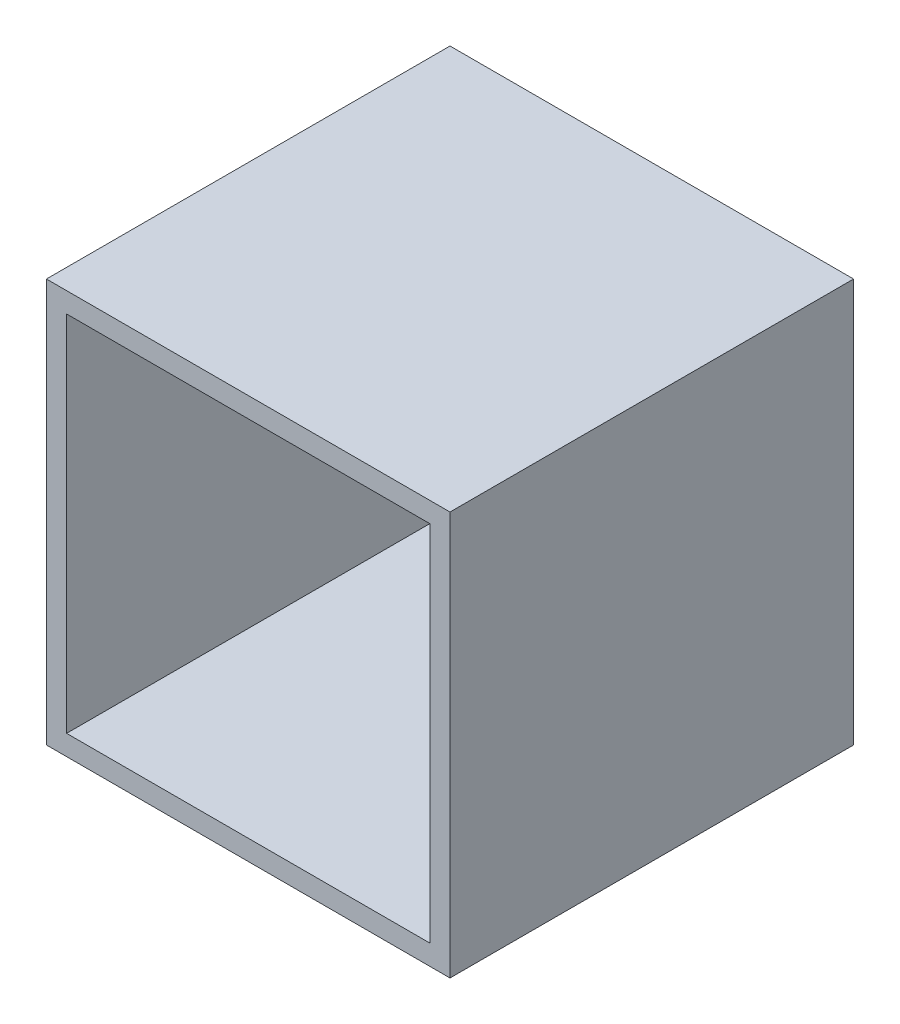
ISO-10303-21;
HEADER;
FILE_DESCRIPTION(('STEP AP214'),'2;1');
FILE_NAME('part.step','',(''),(''),'','','');
FILE_SCHEMA(('AUTOMOTIVE_DESIGN { 1 0 10303 214 1 1 1 1 }'));
ENDSEC;
DATA;
#1=APPLICATION_CONTEXT('core data for automotive mechanical design processes');
#2=APPLICATION_PROTOCOL_DEFINITION('international standard','automotive_design',2000,#1);
#3=PRODUCT_CONTEXT('',#1,'mechanical');
#4=PRODUCT('Part','Part','',(#3));
#5=PRODUCT_RELATED_PRODUCT_CATEGORY('part','',(#4));
#6=PRODUCT_DEFINITION_FORMATION('','',#4);
#7=PRODUCT_DEFINITION_CONTEXT('part definition',#1,'design');
#8=PRODUCT_DEFINITION('design','',#6,#7);
#9=PRODUCT_DEFINITION_SHAPE('','',#8);
#10=(LENGTH_UNIT() NAMED_UNIT(*) SI_UNIT(.MILLI.,.METRE.));
#11=(NAMED_UNIT(*) PLANE_ANGLE_UNIT() SI_UNIT($,.RADIAN.));
#12=(NAMED_UNIT(*) SI_UNIT($,.STERADIAN.) SOLID_ANGLE_UNIT());
#13=UNCERTAINTY_MEASURE_WITH_UNIT(LENGTH_MEASURE(1.E-05),#10,'distance_accuracy_value','');
#14=(GEOMETRIC_REPRESENTATION_CONTEXT(3) GLOBAL_UNCERTAINTY_ASSIGNED_CONTEXT((#13)) GLOBAL_UNIT_ASSIGNED_CONTEXT((#10,
#11,#12)) REPRESENTATION_CONTEXT('',''));
#15=CARTESIAN_POINT('',(0.,0.,0.));
#16=DIRECTION('',(0.,0.,1.));
#17=DIRECTION('',(1.,0.,0.));
#18=AXIS2_PLACEMENT_3D('',#15,#16,#17);
#19=CARTESIAN_POINT('',(0.,100.,100.));
#20=DIRECTION('',(0.,0.,-1.));
#21=DIRECTION('',(-1.,0.,0.));
#22=AXIS2_PLACEMENT_3D('',#19,#20,#21);
#23=PLANE('',#22);
#24=DIRECTION('',(0.,-1.,0.));
#25=VECTOR('',#24,1.);
#26=CARTESIAN_POINT('',(0.,0.,100.));
#27=LINE('',#26,#25);
#28=CARTESIAN_POINT('',(0.,100.,100.));
#29=VERTEX_POINT('',#28);
#30=CARTESIAN_POINT('',(0.,0.,100.));
#31=VERTEX_POINT('',#30);
#32=EDGE_CURVE('E145',#29,#31,#27,.T.);
#33=ORIENTED_EDGE('',*,*,#32,.T.);
#34=DIRECTION('',(1.,0.,0.));
#35=VECTOR('',#34,1.);
#36=CARTESIAN_POINT('',(0.,0.,100.));
#37=LINE('',#36,#35);
#38=CARTESIAN_POINT('',(100.,0.,100.));
#39=VERTEX_POINT('',#38);
#40=EDGE_CURVE('E89',#31,#39,#37,.T.);
#41=ORIENTED_EDGE('',*,*,#40,.T.);
#42=DIRECTION('',(0.,1.,0.));
#43=VECTOR('',#42,1.);
#44=CARTESIAN_POINT('',(100.,0.,100.));
#45=LINE('',#44,#43);
#46=CARTESIAN_POINT('',(100.,100.,100.));
#47=VERTEX_POINT('',#46);
#48=EDGE_CURVE('E148',#39,#47,#45,.T.);
#49=ORIENTED_EDGE('',*,*,#48,.T.);
#50=DIRECTION('',(-1.,0.,0.));
#51=VECTOR('',#50,1.);
#52=CARTESIAN_POINT('',(0.,100.,100.));
#53=LINE('',#52,#51);
#54=EDGE_CURVE('E61',#47,#29,#53,.T.);
#55=ORIENTED_EDGE('',*,*,#54,.T.);
#56=EDGE_LOOP('',(#33,#41,#49,#55));
#57=FACE_BOUND('',#56,.T.);
#58=DIRECTION('',(0.,-1.,0.));
#59=VECTOR('',#58,1.);
#60=CARTESIAN_POINT('',(4.99999999999999,100.,100.));
#61=LINE('',#60,#59);
#62=CARTESIAN_POINT('',(4.99999999999999,95.,100.));
#63=VERTEX_POINT('',#62);
#64=CARTESIAN_POINT('',(5.,5.,100.));
#65=VERTEX_POINT('',#64);
#66=EDGE_CURVE('E134',#63,#65,#61,.T.);
#67=ORIENTED_EDGE('',*,*,#66,.F.);
#68=DIRECTION('',(-1.,0.,0.));
#69=VECTOR('',#68,1.);
#70=CARTESIAN_POINT('',(0.,95.,100.));
#71=LINE('',#70,#69);
#72=CARTESIAN_POINT('',(95.,95.,100.));
#73=VERTEX_POINT('',#72);
#74=EDGE_CURVE('E143',#73,#63,#71,.T.);
#75=ORIENTED_EDGE('',*,*,#74,.F.);
#76=DIRECTION('',(0.,1.,0.));
#77=VECTOR('',#76,1.);
#78=CARTESIAN_POINT('',(95.,100.,100.));
#79=LINE('',#78,#77);
#80=CARTESIAN_POINT('',(95.,5.,100.));
#81=VERTEX_POINT('',#80);
#82=EDGE_CURVE('E141',#81,#73,#79,.T.);
#83=ORIENTED_EDGE('',*,*,#82,.F.);
#84=DIRECTION('',(1.,0.,0.));
#85=VECTOR('',#84,1.);
#86=CARTESIAN_POINT('',(0.,5.,100.));
#87=LINE('',#86,#85);
#88=EDGE_CURVE('E126',#65,#81,#87,.T.);
#89=ORIENTED_EDGE('',*,*,#88,.F.);
#90=EDGE_LOOP('',(#67,#75,#83,#89));
#91=FACE_BOUND('',#90,.T.);
#92=ADVANCED_FACE('F37',(#57,#91),#23,.F.);
#93=CARTESIAN_POINT('',(0.,0.,100.));
#94=DIRECTION('',(1.,0.,0.));
#95=DIRECTION('',(0.,1.,0.));
#96=AXIS2_PLACEMENT_3D('',#93,#94,#95);
#97=PLANE('',#96);
#98=DIRECTION('',(0.,-1.,0.));
#99=VECTOR('',#98,1.);
#100=CARTESIAN_POINT('',(0.,0.,0.));
#101=LINE('',#100,#99);
#102=CARTESIAN_POINT('',(0.,100.,0.));
#103=VERTEX_POINT('',#102);
#104=CARTESIAN_POINT('',(0.,0.,0.));
#105=VERTEX_POINT('',#104);
#106=EDGE_CURVE('E152',#103,#105,#101,.T.);
#107=ORIENTED_EDGE('',*,*,#106,.T.);
#108=DIRECTION('',(0.,0.,-1.));
#109=VECTOR('',#108,1.);
#110=CARTESIAN_POINT('',(0.,0.,100.));
#111=LINE('',#110,#109);
#112=EDGE_CURVE('E11',#31,#105,#111,.T.);
#113=ORIENTED_EDGE('',*,*,#112,.F.);
#114=ORIENTED_EDGE('',*,*,#32,.F.);
#115=DIRECTION('',(0.,0.,-1.));
#116=VECTOR('',#115,1.);
#117=CARTESIAN_POINT('',(0.,100.,100.));
#118=LINE('',#117,#116);
#119=EDGE_CURVE('E151',#29,#103,#118,.T.);
#120=ORIENTED_EDGE('',*,*,#119,.T.);
#121=EDGE_LOOP('',(#107,#113,#114,#120));
#122=FACE_BOUND('',#121,.T.);
#123=ADVANCED_FACE('F39',(#122),#97,.F.);
#124=CARTESIAN_POINT('',(0.,0.,100.));
#125=DIRECTION('',(0.,1.,0.));
#126=DIRECTION('',(0.,0.,1.));
#127=AXIS2_PLACEMENT_3D('',#124,#125,#126);
#128=PLANE('',#127);
#129=DIRECTION('',(1.,0.,0.));
#130=VECTOR('',#129,1.);
#131=CARTESIAN_POINT('',(0.,0.,0.));
#132=LINE('',#131,#130);
#133=CARTESIAN_POINT('',(100.,0.,0.));
#134=VERTEX_POINT('',#133);
#135=EDGE_CURVE('E155',#105,#134,#132,.T.);
#136=ORIENTED_EDGE('',*,*,#135,.T.);
#137=DIRECTION('',(0.,0.,-1.));
#138=VECTOR('',#137,1.);
#139=CARTESIAN_POINT('',(100.,0.,100.));
#140=LINE('',#139,#138);
#141=EDGE_CURVE('E45',#39,#134,#140,.T.);
#142=ORIENTED_EDGE('',*,*,#141,.F.);
#143=ORIENTED_EDGE('',*,*,#40,.F.);
#144=ORIENTED_EDGE('',*,*,#112,.T.);
#145=EDGE_LOOP('',(#136,#142,#143,#144));
#146=FACE_BOUND('',#145,.T.);
#147=ADVANCED_FACE('F183',(#146),#128,.F.);
#148=CARTESIAN_POINT('',(100.,0.,100.));
#149=DIRECTION('',(-1.,0.,0.));
#150=DIRECTION('',(0.,-1.,0.));
#151=AXIS2_PLACEMENT_3D('',#148,#149,#150);
#152=PLANE('',#151);
#153=DIRECTION('',(0.,1.,0.));
#154=VECTOR('',#153,1.);
#155=CARTESIAN_POINT('',(100.,0.,0.));
#156=LINE('',#155,#154);
#157=CARTESIAN_POINT('',(100.,100.,0.));
#158=VERTEX_POINT('',#157);
#159=EDGE_CURVE('E157',#134,#158,#156,.T.);
#160=ORIENTED_EDGE('',*,*,#159,.T.);
#161=DIRECTION('',(0.,0.,-1.));
#162=VECTOR('',#161,1.);
#163=CARTESIAN_POINT('',(100.,100.,100.));
#164=LINE('',#163,#162);
#165=EDGE_CURVE('E161',#47,#158,#164,.T.);
#166=ORIENTED_EDGE('',*,*,#165,.F.);
#167=ORIENTED_EDGE('',*,*,#48,.F.);
#168=ORIENTED_EDGE('',*,*,#141,.T.);
#169=EDGE_LOOP('',(#160,#166,#167,#168));
#170=FACE_BOUND('',#169,.T.);
#171=ADVANCED_FACE('F166',(#170),#152,.F.);
#172=CARTESIAN_POINT('',(0.,100.,100.));
#173=DIRECTION('',(0.,-1.,0.));
#174=DIRECTION('',(0.,0.,-1.));
#175=AXIS2_PLACEMENT_3D('',#172,#173,#174);
#176=PLANE('',#175);
#177=DIRECTION('',(-1.,0.,0.));
#178=VECTOR('',#177,1.);
#179=CARTESIAN_POINT('',(0.,100.,0.));
#180=LINE('',#179,#178);
#181=EDGE_CURVE('E82',#158,#103,#180,.T.);
#182=ORIENTED_EDGE('',*,*,#181,.T.);
#183=ORIENTED_EDGE('',*,*,#119,.F.);
#184=ORIENTED_EDGE('',*,*,#54,.F.);
#185=ORIENTED_EDGE('',*,*,#165,.T.);
#186=EDGE_LOOP('',(#182,#183,#184,#185));
#187=FACE_BOUND('',#186,.T.);
#188=ADVANCED_FACE('F174',(#187),#176,.F.);
#189=CARTESIAN_POINT('',(0.,100.,0.));
#190=DIRECTION('',(0.,0.,-1.));
#191=DIRECTION('',(-1.,0.,0.));
#192=AXIS2_PLACEMENT_3D('',#189,#190,#191);
#193=PLANE('',#192);
#194=ORIENTED_EDGE('',*,*,#106,.F.);
#195=ORIENTED_EDGE('',*,*,#181,.F.);
#196=ORIENTED_EDGE('',*,*,#159,.F.);
#197=ORIENTED_EDGE('',*,*,#135,.F.);
#198=EDGE_LOOP('',(#194,#195,#196,#197));
#199=FACE_BOUND('',#198,.T.);
#200=ADVANCED_FACE('F170',(#199),#193,.T.);
#201=CARTESIAN_POINT('',(5.,0.,100.));
#202=DIRECTION('',(1.,0.,0.));
#203=DIRECTION('',(0.,1.,0.));
#204=AXIS2_PLACEMENT_3D('',#201,#202,#203);
#205=PLANE('',#204);
#206=DIRECTION('',(0.,-1.,0.));
#207=VECTOR('',#206,1.);
#208=CARTESIAN_POINT('',(4.99999999999999,100.,5.));
#209=LINE('',#208,#207);
#210=CARTESIAN_POINT('',(4.99999999999999,95.,5.));
#211=VERTEX_POINT('',#210);
#212=CARTESIAN_POINT('',(5.,5.,5.));
#213=VERTEX_POINT('',#212);
#214=EDGE_CURVE('E117',#211,#213,#209,.T.);
#215=ORIENTED_EDGE('',*,*,#214,.F.);
#216=DIRECTION('',(0.,0.,-1.));
#217=VECTOR('',#216,1.);
#218=CARTESIAN_POINT('',(4.99999999999999,95.,100.));
#219=LINE('',#218,#217);
#220=EDGE_CURVE('E137',#63,#211,#219,.T.);
#221=ORIENTED_EDGE('',*,*,#220,.F.);
#222=ORIENTED_EDGE('',*,*,#66,.T.);
#223=DIRECTION('',(0.,0.,-1.));
#224=VECTOR('',#223,1.);
#225=CARTESIAN_POINT('',(5.,5.,100.));
#226=LINE('',#225,#224);
#227=EDGE_CURVE('E129',#65,#213,#226,.T.);
#228=ORIENTED_EDGE('',*,*,#227,.T.);
#229=EDGE_LOOP('',(#215,#221,#222,#228));
#230=FACE_BOUND('',#229,.T.);
#231=ADVANCED_FACE('F181',(#230),#205,.T.);
#232=CARTESIAN_POINT('',(0.,5.,100.));
#233=DIRECTION('',(0.,1.,0.));
#234=DIRECTION('',(0.,0.,1.));
#235=AXIS2_PLACEMENT_3D('',#232,#233,#234);
#236=PLANE('',#235);
#237=DIRECTION('',(1.,0.,0.));
#238=VECTOR('',#237,1.);
#239=CARTESIAN_POINT('',(0.,5.,5.));
#240=LINE('',#239,#238);
#241=CARTESIAN_POINT('',(95.,5.,5.));
#242=VERTEX_POINT('',#241);
#243=EDGE_CURVE('E111',#213,#242,#240,.T.);
#244=ORIENTED_EDGE('',*,*,#243,.F.);
#245=ORIENTED_EDGE('',*,*,#227,.F.);
#246=ORIENTED_EDGE('',*,*,#88,.T.);
#247=DIRECTION('',(0.,0.,-1.));
#248=VECTOR('',#247,1.);
#249=CARTESIAN_POINT('',(95.,5.,100.));
#250=LINE('',#249,#248);
#251=EDGE_CURVE('E123',#81,#242,#250,.T.);
#252=ORIENTED_EDGE('',*,*,#251,.T.);
#253=EDGE_LOOP('',(#244,#245,#246,#252));
#254=FACE_BOUND('',#253,.T.);
#255=ADVANCED_FACE('F124',(#254),#236,.T.);
#256=CARTESIAN_POINT('',(95.,0.,100.));
#257=DIRECTION('',(-1.,0.,0.));
#258=DIRECTION('',(0.,-1.,0.));
#259=AXIS2_PLACEMENT_3D('',#256,#257,#258);
#260=PLANE('',#259);
#261=DIRECTION('',(0.,1.,0.));
#262=VECTOR('',#261,1.);
#263=CARTESIAN_POINT('',(95.,100.,5.));
#264=LINE('',#263,#262);
#265=CARTESIAN_POINT('',(95.,95.,5.));
#266=VERTEX_POINT('',#265);
#267=EDGE_CURVE('E115',#242,#266,#264,.T.);
#268=ORIENTED_EDGE('',*,*,#267,.F.);
#269=ORIENTED_EDGE('',*,*,#251,.F.);
#270=ORIENTED_EDGE('',*,*,#82,.T.);
#271=DIRECTION('',(0.,0.,-1.));
#272=VECTOR('',#271,1.);
#273=CARTESIAN_POINT('',(95.,95.,100.));
#274=LINE('',#273,#272);
#275=EDGE_CURVE('E52',#73,#266,#274,.T.);
#276=ORIENTED_EDGE('',*,*,#275,.T.);
#277=EDGE_LOOP('',(#268,#269,#270,#276));
#278=FACE_BOUND('',#277,.T.);
#279=ADVANCED_FACE('F131',(#278),#260,.T.);
#280=CARTESIAN_POINT('',(0.,95.,100.));
#281=DIRECTION('',(0.,-1.,0.));
#282=DIRECTION('',(0.,0.,-1.));
#283=AXIS2_PLACEMENT_3D('',#280,#281,#282);
#284=PLANE('',#283);
#285=DIRECTION('',(-1.,0.,0.));
#286=VECTOR('',#285,1.);
#287=CARTESIAN_POINT('',(0.,95.,5.));
#288=LINE('',#287,#286);
#289=EDGE_CURVE('E132',#266,#211,#288,.T.);
#290=ORIENTED_EDGE('',*,*,#289,.F.);
#291=ORIENTED_EDGE('',*,*,#275,.F.);
#292=ORIENTED_EDGE('',*,*,#74,.T.);
#293=ORIENTED_EDGE('',*,*,#220,.T.);
#294=EDGE_LOOP('',(#290,#291,#292,#293));
#295=FACE_BOUND('',#294,.T.);
#296=ADVANCED_FACE('F194',(#295),#284,.T.);
#297=CARTESIAN_POINT('',(0.,100.,5.));
#298=DIRECTION('',(0.,0.,-1.));
#299=DIRECTION('',(-1.,0.,0.));
#300=AXIS2_PLACEMENT_3D('',#297,#298,#299);
#301=PLANE('',#300);
#302=ORIENTED_EDGE('',*,*,#214,.T.);
#303=ORIENTED_EDGE('',*,*,#243,.T.);
#304=ORIENTED_EDGE('',*,*,#267,.T.);
#305=ORIENTED_EDGE('',*,*,#289,.T.);
#306=EDGE_LOOP('',(#302,#303,#304,#305));
#307=FACE_BOUND('',#306,.T.);
#308=ADVANCED_FACE('F113',(#307),#301,.F.);
#309=CLOSED_SHELL('',(#92,#123,#147,#171,#188,#200,#231,#255,#279,#296,#308));
#310=MANIFOLD_SOLID_BREP('B2',#309);
#311=ADVANCED_BREP_SHAPE_REPRESENTATION('',(#18,#310),#14);
#312=SHAPE_DEFINITION_REPRESENTATION(#9,#311);
ENDSEC;
END-ISO-10303-21;
